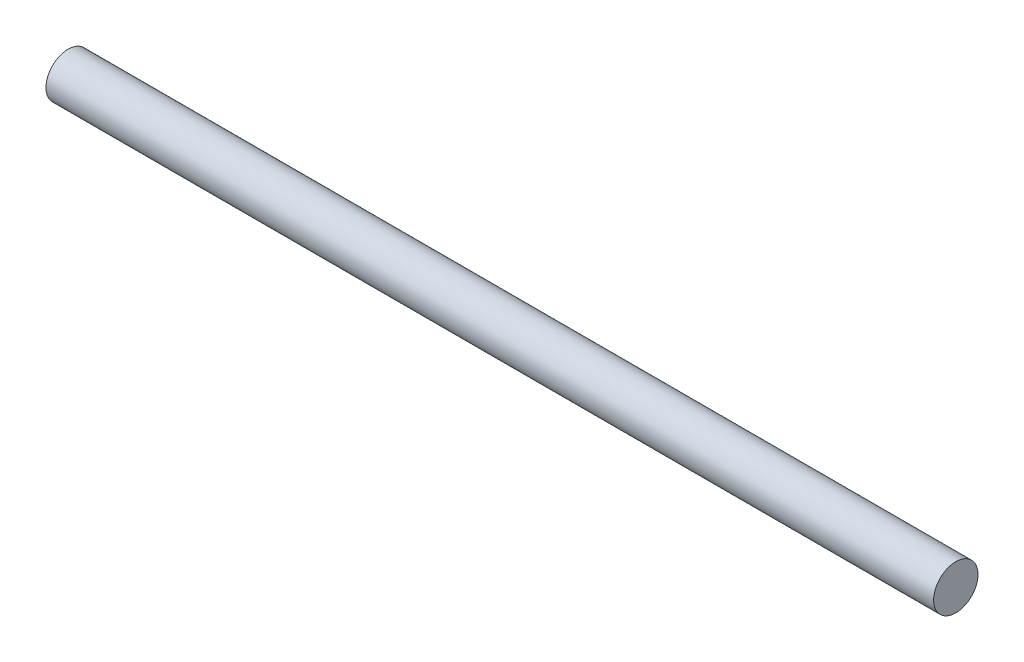
ISO-10303-21;
HEADER;
FILE_DESCRIPTION(('STEP AP214'),'2;1');
FILE_NAME('part.step','',(''),(''),'','','');
FILE_SCHEMA(('AUTOMOTIVE_DESIGN { 1 0 10303 214 1 1 1 1 }'));
ENDSEC;
DATA;
#1=APPLICATION_CONTEXT('core data for automotive mechanical design processes');
#2=APPLICATION_PROTOCOL_DEFINITION('international standard','automotive_design',2000,#1);
#3=PRODUCT_CONTEXT('',#1,'mechanical');
#4=PRODUCT('Part','Part','',(#3));
#5=PRODUCT_RELATED_PRODUCT_CATEGORY('part','',(#4));
#6=PRODUCT_DEFINITION_FORMATION('','',#4);
#7=PRODUCT_DEFINITION_CONTEXT('part definition',#1,'design');
#8=PRODUCT_DEFINITION('design','',#6,#7);
#9=PRODUCT_DEFINITION_SHAPE('','',#8);
#10=(LENGTH_UNIT() NAMED_UNIT(*) SI_UNIT(.MILLI.,.METRE.));
#11=(NAMED_UNIT(*) PLANE_ANGLE_UNIT() SI_UNIT($,.RADIAN.));
#12=(NAMED_UNIT(*) SI_UNIT($,.STERADIAN.) SOLID_ANGLE_UNIT());
#13=UNCERTAINTY_MEASURE_WITH_UNIT(LENGTH_MEASURE(1.E-05),#10,'distance_accuracy_value','');
#14=(GEOMETRIC_REPRESENTATION_CONTEXT(3) GLOBAL_UNCERTAINTY_ASSIGNED_CONTEXT((#13)) GLOBAL_UNIT_ASSIGNED_CONTEXT((#10,
#11,#12)) REPRESENTATION_CONTEXT('',''));
#15=CARTESIAN_POINT('',(0.,0.,0.));
#16=DIRECTION('',(0.,0.,1.));
#17=DIRECTION('',(1.,0.,0.));
#18=AXIS2_PLACEMENT_3D('',#15,#16,#17);
#19=CARTESIAN_POINT('',(127.,0.,0.));
#20=DIRECTION('',(-1.,0.,0.));
#21=DIRECTION('',(0.,0.,1.));
#22=AXIS2_PLACEMENT_3D('',#19,#20,#21);
#23=CYLINDRICAL_SURFACE('',#22,3.175);
#24=CARTESIAN_POINT('',(127.,0.,0.));
#25=DIRECTION('',(1.,0.,0.));
#26=DIRECTION('',(0.,0.,-1.));
#27=AXIS2_PLACEMENT_3D('',#24,#25,#26);
#28=CIRCLE('',#27,3.175);
#29=CARTESIAN_POINT('',(127.,0.,-3.175));
#30=VERTEX_POINT('',#29);
#31=EDGE_CURVE('E10',#30,#30,#28,.T.);
#32=ORIENTED_EDGE('',*,*,#31,.F.);
#33=EDGE_LOOP('',(#32));
#34=FACE_BOUND('',#33,.T.);
#35=CARTESIAN_POINT('',(0.,0.,0.));
#36=DIRECTION('',(1.,0.,0.));
#37=DIRECTION('',(0.,0.,-1.));
#38=AXIS2_PLACEMENT_3D('',#35,#36,#37);
#39=CIRCLE('',#38,3.175);
#40=CARTESIAN_POINT('',(0.,0.,-3.175));
#41=VERTEX_POINT('',#40);
#42=EDGE_CURVE('E34',#41,#41,#39,.T.);
#43=ORIENTED_EDGE('',*,*,#42,.T.);
#44=EDGE_LOOP('',(#43));
#45=FACE_BOUND('',#44,.T.);
#46=ADVANCED_FACE('F31',(#34,#45),#23,.T.);
#47=CARTESIAN_POINT('',(127.,0.,0.));
#48=DIRECTION('',(1.,0.,0.));
#49=DIRECTION('',(0.,0.,-1.));
#50=AXIS2_PLACEMENT_3D('',#47,#48,#49);
#51=PLANE('',#50);
#52=ORIENTED_EDGE('',*,*,#31,.T.);
#53=EDGE_LOOP('',(#52));
#54=FACE_BOUND('',#53,.T.);
#55=ADVANCED_FACE('F46',(#54),#51,.T.);
#56=CARTESIAN_POINT('',(0.,0.,0.));
#57=DIRECTION('',(1.,0.,0.));
#58=DIRECTION('',(0.,0.,-1.));
#59=AXIS2_PLACEMENT_3D('',#56,#57,#58);
#60=PLANE('',#59);
#61=ORIENTED_EDGE('',*,*,#42,.F.);
#62=EDGE_LOOP('',(#61));
#63=FACE_BOUND('',#62,.T.);
#64=ADVANCED_FACE('F44',(#63),#60,.F.);
#65=CLOSED_SHELL('',(#46,#55,#64));
#66=MANIFOLD_SOLID_BREP('B2',#65);
#67=ADVANCED_BREP_SHAPE_REPRESENTATION('',(#18,#66),#14);
#68=SHAPE_DEFINITION_REPRESENTATION(#9,#67);
ENDSEC;
END-ISO-10303-21;
